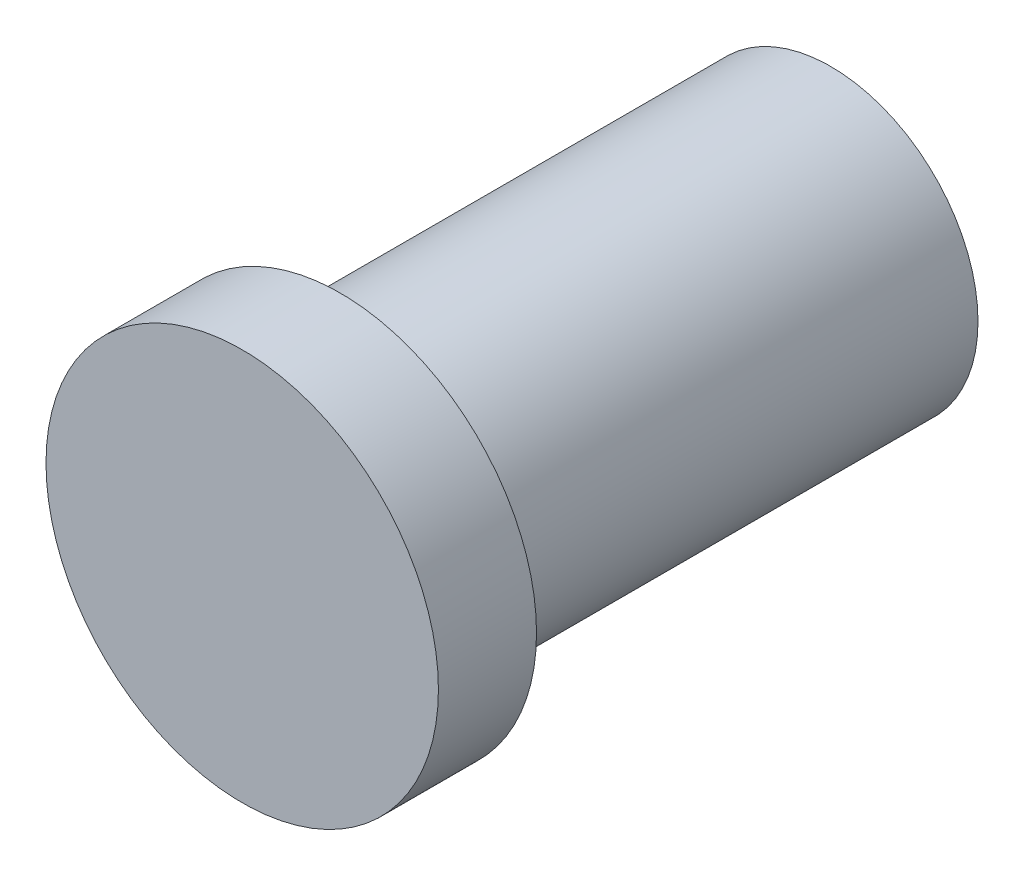
ISO-10303-21;
HEADER;
FILE_DESCRIPTION(('STEP AP214'),'2;1');
FILE_NAME('part.step','',(''),(''),'','','');
FILE_SCHEMA(('AUTOMOTIVE_DESIGN { 1 0 10303 214 1 1 1 1 }'));
ENDSEC;
DATA;
#1=APPLICATION_CONTEXT('core data for automotive mechanical design processes');
#2=APPLICATION_PROTOCOL_DEFINITION('international standard','automotive_design',2000,#1);
#3=PRODUCT_CONTEXT('',#1,'mechanical');
#4=PRODUCT('Part','Part','',(#3));
#5=PRODUCT_RELATED_PRODUCT_CATEGORY('part','',(#4));
#6=PRODUCT_DEFINITION_FORMATION('','',#4);
#7=PRODUCT_DEFINITION_CONTEXT('part definition',#1,'design');
#8=PRODUCT_DEFINITION('design','',#6,#7);
#9=PRODUCT_DEFINITION_SHAPE('','',#8);
#10=(LENGTH_UNIT() NAMED_UNIT(*) SI_UNIT(.MILLI.,.METRE.));
#11=(NAMED_UNIT(*) PLANE_ANGLE_UNIT() SI_UNIT($,.RADIAN.));
#12=(NAMED_UNIT(*) SI_UNIT($,.STERADIAN.) SOLID_ANGLE_UNIT());
#13=UNCERTAINTY_MEASURE_WITH_UNIT(LENGTH_MEASURE(1.E-05),#10,'distance_accuracy_value','');
#14=(GEOMETRIC_REPRESENTATION_CONTEXT(3) GLOBAL_UNCERTAINTY_ASSIGNED_CONTEXT((#13)) GLOBAL_UNIT_ASSIGNED_CONTEXT((#10,
#11,#12)) REPRESENTATION_CONTEXT('',''));
#15=CARTESIAN_POINT('',(0.,0.,0.));
#16=DIRECTION('',(0.,0.,1.));
#17=DIRECTION('',(1.,0.,0.));
#18=AXIS2_PLACEMENT_3D('',#15,#16,#17);
#19=CARTESIAN_POINT('',(0.,0.,12.7));
#20=DIRECTION('',(0.,0.,-1.));
#21=DIRECTION('',(-1.,0.,0.));
#22=AXIS2_PLACEMENT_3D('',#19,#20,#21);
#23=CYLINDRICAL_SURFACE('',#22,3.81);
#24=CARTESIAN_POINT('',(0.,0.,12.7));
#25=DIRECTION('',(0.,0.,1.));
#26=DIRECTION('',(1.,0.,0.));
#27=AXIS2_PLACEMENT_3D('',#24,#25,#26);
#28=CIRCLE('',#27,3.81);
#29=CARTESIAN_POINT('',(3.81,0.,12.7));
#30=VERTEX_POINT('',#29);
#31=EDGE_CURVE('E10',#30,#30,#28,.T.);
#32=ORIENTED_EDGE('',*,*,#31,.F.);
#33=EDGE_LOOP('',(#32));
#34=FACE_BOUND('',#33,.T.);
#35=CARTESIAN_POINT('',(0.,0.,0.));
#36=DIRECTION('',(0.,0.,1.));
#37=DIRECTION('',(1.,0.,0.));
#38=AXIS2_PLACEMENT_3D('',#35,#36,#37);
#39=CIRCLE('',#38,3.81);
#40=CARTESIAN_POINT('',(3.81,0.,0.));
#41=VERTEX_POINT('',#40);
#42=EDGE_CURVE('E33',#41,#41,#39,.T.);
#43=ORIENTED_EDGE('',*,*,#42,.T.);
#44=EDGE_LOOP('',(#43));
#45=FACE_BOUND('',#44,.T.);
#46=ADVANCED_FACE('F30',(#34,#45),#23,.T.);
#47=CARTESIAN_POINT('',(0.,0.,0.));
#48=DIRECTION('',(0.,0.,1.));
#49=DIRECTION('',(1.,0.,0.));
#50=AXIS2_PLACEMENT_3D('',#47,#48,#49);
#51=PLANE('',#50);
#52=ORIENTED_EDGE('',*,*,#42,.F.);
#53=EDGE_LOOP('',(#52));
#54=FACE_BOUND('',#53,.T.);
#55=ADVANCED_FACE('F53',(#54),#51,.F.);
#56=CARTESIAN_POINT('',(0.,0.,15.24));
#57=DIRECTION('',(0.,0.,-1.));
#58=DIRECTION('',(-1.,0.,0.));
#59=AXIS2_PLACEMENT_3D('',#56,#57,#58);
#60=CYLINDRICAL_SURFACE('',#59,5.08);
#61=CARTESIAN_POINT('',(0.,0.,15.24));
#62=DIRECTION('',(0.,0.,1.));
#63=DIRECTION('',(1.,0.,0.));
#64=AXIS2_PLACEMENT_3D('',#61,#62,#63);
#65=CIRCLE('',#64,5.08);
#66=CARTESIAN_POINT('',(5.08,0.,15.24));
#67=VERTEX_POINT('',#66);
#68=EDGE_CURVE('E40',#67,#67,#65,.T.);
#69=ORIENTED_EDGE('',*,*,#68,.F.);
#70=EDGE_LOOP('',(#69));
#71=FACE_BOUND('',#70,.T.);
#72=CARTESIAN_POINT('',(0.,0.,12.7));
#73=DIRECTION('',(0.,0.,1.));
#74=DIRECTION('',(1.,0.,0.));
#75=AXIS2_PLACEMENT_3D('',#72,#73,#74);
#76=CIRCLE('',#75,5.08);
#77=CARTESIAN_POINT('',(5.08,0.,12.7));
#78=VERTEX_POINT('',#77);
#79=EDGE_CURVE('E42',#78,#78,#76,.T.);
#80=ORIENTED_EDGE('',*,*,#79,.T.);
#81=EDGE_LOOP('',(#80));
#82=FACE_BOUND('',#81,.T.);
#83=ADVANCED_FACE('F50',(#71,#82),#60,.T.);
#84=CARTESIAN_POINT('',(0.,0.,15.24));
#85=DIRECTION('',(0.,0.,1.));
#86=DIRECTION('',(1.,0.,0.));
#87=AXIS2_PLACEMENT_3D('',#84,#85,#86);
#88=PLANE('',#87);
#89=ORIENTED_EDGE('',*,*,#68,.T.);
#90=EDGE_LOOP('',(#89));
#91=FACE_BOUND('',#90,.T.);
#92=ADVANCED_FACE('F48',(#91),#88,.T.);
#93=CARTESIAN_POINT('',(0.,0.,12.7));
#94=DIRECTION('',(0.,0.,1.));
#95=DIRECTION('',(1.,0.,0.));
#96=AXIS2_PLACEMENT_3D('',#93,#94,#95);
#97=PLANE('',#96);
#98=ORIENTED_EDGE('',*,*,#31,.T.);
#99=EDGE_LOOP('',(#98));
#100=FACE_BOUND('',#99,.T.);
#101=ORIENTED_EDGE('',*,*,#79,.F.);
#102=EDGE_LOOP('',(#101));
#103=FACE_BOUND('',#102,.T.);
#104=ADVANCED_FACE('F57',(#100,#103),#97,.F.);
#105=CLOSED_SHELL('',(#46,#55,#83,#92,#104));
#106=MANIFOLD_SOLID_BREP('B2',#105);
#107=ADVANCED_BREP_SHAPE_REPRESENTATION('',(#18,#106),#14);
#108=SHAPE_DEFINITION_REPRESENTATION(#9,#107);
ENDSEC;
END-ISO-10303-21;
